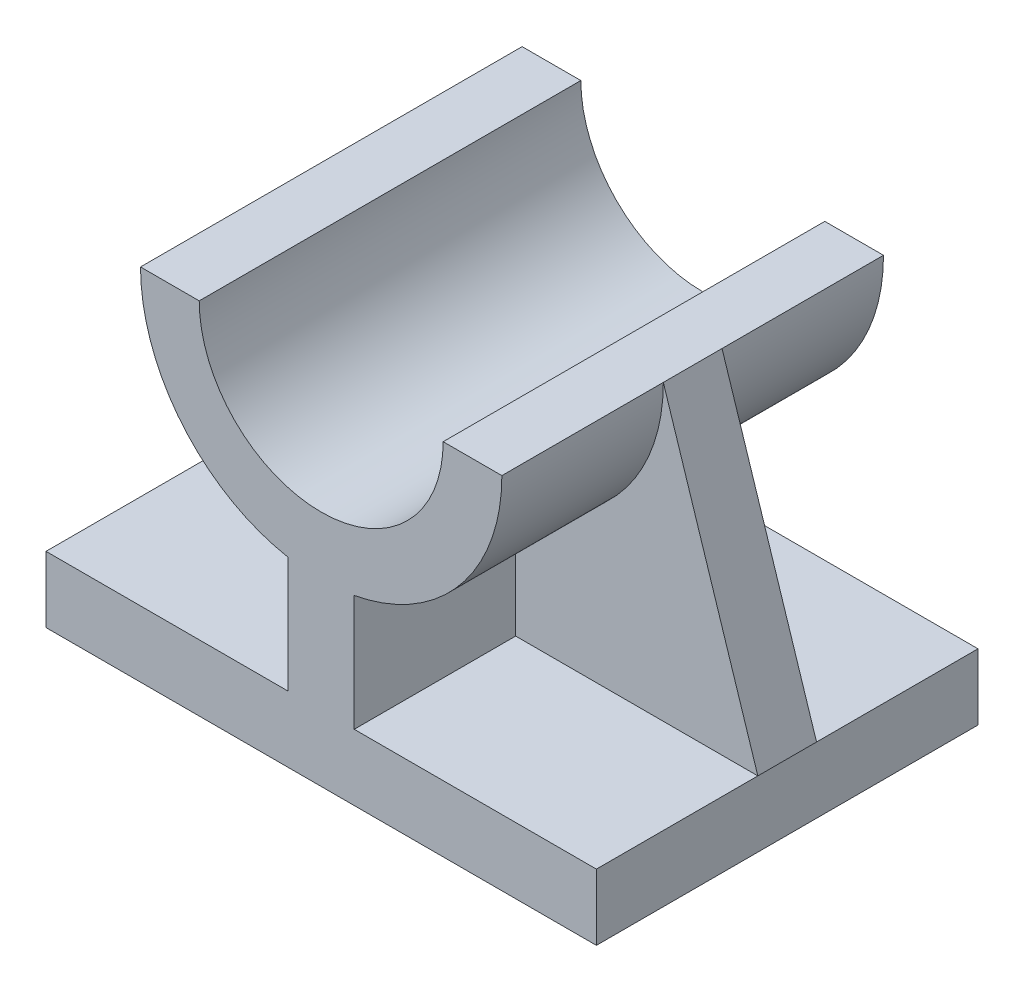
ISO-10303-21;
HEADER;
FILE_DESCRIPTION(('STEP AP214'),'2;1');
FILE_NAME('part.step','',(''),(''),'','','');
FILE_SCHEMA(('AUTOMOTIVE_DESIGN { 1 0 10303 214 1 1 1 1 }'));
ENDSEC;
DATA;
#1=APPLICATION_CONTEXT('core data for automotive mechanical design processes');
#2=APPLICATION_PROTOCOL_DEFINITION('international standard','automotive_design',2000,#1);
#3=PRODUCT_CONTEXT('',#1,'mechanical');
#4=PRODUCT('Part','Part','',(#3));
#5=PRODUCT_RELATED_PRODUCT_CATEGORY('part','',(#4));
#6=PRODUCT_DEFINITION_FORMATION('','',#4);
#7=PRODUCT_DEFINITION_CONTEXT('part definition',#1,'design');
#8=PRODUCT_DEFINITION('design','',#6,#7);
#9=PRODUCT_DEFINITION_SHAPE('','',#8);
#10=(LENGTH_UNIT() NAMED_UNIT(*) SI_UNIT(.MILLI.,.METRE.));
#11=(NAMED_UNIT(*) PLANE_ANGLE_UNIT() SI_UNIT($,.RADIAN.));
#12=(NAMED_UNIT(*) SI_UNIT($,.STERADIAN.) SOLID_ANGLE_UNIT());
#13=UNCERTAINTY_MEASURE_WITH_UNIT(LENGTH_MEASURE(1.E-05),#10,'distance_accuracy_value','');
#14=(GEOMETRIC_REPRESENTATION_CONTEXT(3) GLOBAL_UNCERTAINTY_ASSIGNED_CONTEXT((#13)) GLOBAL_UNIT_ASSIGNED_CONTEXT((#10,
#11,#12)) REPRESENTATION_CONTEXT('',''));
#15=CARTESIAN_POINT('',(0.,0.,0.));
#16=DIRECTION('',(0.,0.,1.));
#17=DIRECTION('',(1.,0.,0.));
#18=AXIS2_PLACEMENT_3D('',#15,#16,#17);
#19=CARTESIAN_POINT('',(0.,8.99999999999999,-26.));
#20=DIRECTION('',(0.,-1.,0.));
#21=DIRECTION('',(1.,0.,0.));
#22=AXIS2_PLACEMENT_3D('',#19,#20,#21);
#23=PLANE('',#22);
#24=DIRECTION('',(1.,0.,0.));
#25=VECTOR('',#24,1.);
#26=CARTESIAN_POINT('',(-4.91390728476821,8.99999999999999,-4.));
#27=LINE('',#26,#25);
#28=CARTESIAN_POINT('',(-37.9139072847682,8.99999999999999,-4.));
#29=VERTEX_POINT('',#28);
#30=CARTESIAN_POINT('',(-4.91390728476821,8.99999999999999,-4.));
#31=VERTEX_POINT('',#30);
#32=EDGE_CURVE('E200',#29,#31,#27,.T.);
#33=ORIENTED_EDGE('',*,*,#32,.T.);
#34=DIRECTION('',(0.,0.,1.));
#35=VECTOR('',#34,1.);
#36=CARTESIAN_POINT('',(-4.91390728476821,8.99999999999999,-26.));
#37=LINE('',#36,#35);
#38=CARTESIAN_POINT('',(-4.91390728476821,8.99999999999999,-26.));
#39=VERTEX_POINT('',#38);
#40=EDGE_CURVE('E199',#39,#31,#37,.T.);
#41=ORIENTED_EDGE('',*,*,#40,.F.);
#42=DIRECTION('',(1.,0.,0.));
#43=VECTOR('',#42,1.);
#44=CARTESIAN_POINT('',(0.,8.99999999999999,-26.));
#45=LINE('',#44,#43);
#46=CARTESIAN_POINT('',(-37.9139072847682,8.99999999999999,-26.));
#47=VERTEX_POINT('',#46);
#48=EDGE_CURVE('E241',#47,#39,#45,.T.);
#49=ORIENTED_EDGE('',*,*,#48,.F.);
#50=DIRECTION('',(0.,0.,1.));
#51=VECTOR('',#50,1.);
#52=CARTESIAN_POINT('',(-37.9139072847682,8.99999999999999,-26.));
#53=LINE('',#52,#51);
#54=EDGE_CURVE('E411',#47,#29,#53,.T.);
#55=ORIENTED_EDGE('',*,*,#54,.T.);
#56=EDGE_LOOP('',(#33,#41,#49,#55));
#57=FACE_BOUND('',#56,.T.);
#58=ADVANCED_FACE('F39',(#57),#23,.F.);
#59=CARTESIAN_POINT('',(-4.91390728476821,0.,-26.));
#60=DIRECTION('',(1.,0.,0.));
#61=DIRECTION('',(0.,0.,-1.));
#62=AXIS2_PLACEMENT_3D('',#59,#60,#61);
#63=PLANE('',#62);
#64=DIRECTION('',(0.,1.,0.));
#65=VECTOR('',#64,1.);
#66=CARTESIAN_POINT('',(-4.91390728476821,24.7934717245168,-4.));
#67=LINE('',#66,#65);
#68=CARTESIAN_POINT('',(-4.91390728476821,24.7934717245168,-4.));
#69=VERTEX_POINT('',#68);
#70=EDGE_CURVE('E182',#31,#69,#67,.T.);
#71=ORIENTED_EDGE('',*,*,#70,.T.);
#72=DIRECTION('',(0.,0.,1.));
#73=VECTOR('',#72,1.);
#74=CARTESIAN_POINT('',(-4.91390728476821,24.7934717245168,-26.));
#75=LINE('',#74,#73);
#76=CARTESIAN_POINT('',(-4.91390728476821,24.7934717245168,-26.));
#77=VERTEX_POINT('',#76);
#78=EDGE_CURVE('E196',#77,#69,#75,.T.);
#79=ORIENTED_EDGE('',*,*,#78,.F.);
#80=DIRECTION('',(0.,1.,0.));
#81=VECTOR('',#80,1.);
#82=CARTESIAN_POINT('',(-4.91390728476821,0.,-26.));
#83=LINE('',#82,#81);
#84=EDGE_CURVE('E253',#39,#77,#83,.T.);
#85=ORIENTED_EDGE('',*,*,#84,.F.);
#86=ORIENTED_EDGE('',*,*,#40,.T.);
#87=EDGE_LOOP('',(#71,#79,#85,#86));
#88=FACE_BOUND('',#87,.T.);
#89=ADVANCED_FACE('F194',(#88),#63,.F.);
#90=CARTESIAN_POINT('',(-0.413907284768214,49.,-26.));
#91=DIRECTION('',(0.,0.,1.));
#92=DIRECTION('',(1.,0.,0.));
#93=AXIS2_PLACEMENT_3D('',#90,#91,#92);
#94=CYLINDRICAL_SURFACE('',#93,24.6212512101186);
#95=ORIENTED_EDGE('',*,*,#78,.T.);
#96=CARTESIAN_POINT('',(-0.41390728476815,49.,-4.));
#97=DIRECTION('',(0.,0.,-1.));
#98=DIRECTION('',(1.,0.,0.));
#99=AXIS2_PLACEMENT_3D('',#96,#97,#98);
#100=CIRCLE('',#99,24.6212512101187);
#101=CARTESIAN_POINT('',(-25.0351584948868,48.9999999999998,-4.));
#102=VERTEX_POINT('',#101);
#103=EDGE_CURVE('E178',#69,#102,#100,.T.);
#104=ORIENTED_EDGE('',*,*,#103,.T.);
#105=DIRECTION('',(0.,0.,1.));
#106=VECTOR('',#105,1.);
#107=CARTESIAN_POINT('',(-25.0351584948868,49.,-26.));
#108=LINE('',#107,#106);
#109=CARTESIAN_POINT('',(-25.0351584948868,49.,-26.));
#110=VERTEX_POINT('',#109);
#111=EDGE_CURVE('E209',#110,#102,#108,.T.);
#112=ORIENTED_EDGE('',*,*,#111,.F.);
#113=CARTESIAN_POINT('',(-0.413907284768214,49.,-26.));
#114=DIRECTION('',(0.,0.,1.));
#115=DIRECTION('',(1.,0.,0.));
#116=AXIS2_PLACEMENT_3D('',#113,#114,#115);
#117=CIRCLE('',#116,24.6212512101186);
#118=EDGE_CURVE('E204',#110,#77,#117,.T.);
#119=ORIENTED_EDGE('',*,*,#118,.T.);
#120=EDGE_LOOP('',(#95,#104,#112,#119));
#121=FACE_BOUND('',#120,.T.);
#122=ADVANCED_FACE('F202',(#121),#94,.T.);
#123=CARTESIAN_POINT('',(4.08609271523178,0.,-26.));
#124=DIRECTION('',(1.,0.,0.));
#125=DIRECTION('',(0.,0.,-1.));
#126=AXIS2_PLACEMENT_3D('',#123,#124,#125);
#127=PLANE('',#126);
#128=DIRECTION('',(0.,0.,1.));
#129=VECTOR('',#128,1.);
#130=CARTESIAN_POINT('',(4.08609271523178,24.7934717245168,-26.));
#131=LINE('',#130,#129);
#132=CARTESIAN_POINT('',(4.08609271523178,24.7934717245168,-26.));
#133=VERTEX_POINT('',#132);
#134=CARTESIAN_POINT('',(4.08609271523178,24.7934717245168,-4.00000000000001));
#135=VERTEX_POINT('',#134);
#136=EDGE_CURVE('E43',#133,#135,#131,.T.);
#137=ORIENTED_EDGE('',*,*,#136,.T.);
#138=DIRECTION('',(0.,-1.,0.));
#139=VECTOR('',#138,1.);
#140=CARTESIAN_POINT('',(4.08609271523178,9.,-4.));
#141=LINE('',#140,#139);
#142=CARTESIAN_POINT('',(4.08609271523178,9.,-4.));
#143=VERTEX_POINT('',#142);
#144=EDGE_CURVE('E64',#135,#143,#141,.T.);
#145=ORIENTED_EDGE('',*,*,#144,.T.);
#146=DIRECTION('',(0.,0.,1.));
#147=VECTOR('',#146,1.);
#148=CARTESIAN_POINT('',(4.08609271523178,9.,-26.));
#149=LINE('',#148,#147);
#150=CARTESIAN_POINT('',(4.08609271523178,9.,-26.));
#151=VERTEX_POINT('',#150);
#152=EDGE_CURVE('E11',#151,#143,#149,.T.);
#153=ORIENTED_EDGE('',*,*,#152,.F.);
#154=DIRECTION('',(0.,1.,0.));
#155=VECTOR('',#154,1.);
#156=CARTESIAN_POINT('',(4.08609271523178,0.,-26.));
#157=LINE('',#156,#155);
#158=EDGE_CURVE('E263',#151,#133,#157,.T.);
#159=ORIENTED_EDGE('',*,*,#158,.T.);
#160=EDGE_LOOP('',(#137,#145,#153,#159));
#161=FACE_BOUND('',#160,.T.);
#162=ADVANCED_FACE('F341',(#161),#127,.T.);
#163=DIRECTION('',(1.,0.,0.));
#164=VECTOR('',#163,1.);
#165=CARTESIAN_POINT('',(37.0860927152318,9.,-4.));
#166=LINE('',#165,#164);
#167=CARTESIAN_POINT('',(37.0860927152318,9.,-4.));
#168=VERTEX_POINT('',#167);
#169=EDGE_CURVE('E276',#143,#168,#166,.T.);
#170=ORIENTED_EDGE('',*,*,#169,.T.);
#171=DIRECTION('',(0.,0.,1.));
#172=VECTOR('',#171,1.);
#173=CARTESIAN_POINT('',(37.0860927152318,9.,-26.));
#174=LINE('',#173,#172);
#175=CARTESIAN_POINT('',(37.0860927152318,9.,-26.));
#176=VERTEX_POINT('',#175);
#177=EDGE_CURVE('E404',#176,#168,#174,.T.);
#178=ORIENTED_EDGE('',*,*,#177,.F.);
#179=EDGE_CURVE('E234',#151,#176,#45,.T.);
#180=ORIENTED_EDGE('',*,*,#179,.F.);
#181=ORIENTED_EDGE('',*,*,#152,.T.);
#182=EDGE_LOOP('',(#170,#178,#180,#181));
#183=FACE_BOUND('',#182,.T.);
#184=ADVANCED_FACE('F332',(#183),#23,.F.);
#185=DIRECTION('',(0.,0.,1.));
#186=VECTOR('',#185,1.);
#187=CARTESIAN_POINT('',(24.2073439253504,49.,-26.));
#188=LINE('',#187,#186);
#189=CARTESIAN_POINT('',(24.2073439253504,49.,-26.));
#190=VERTEX_POINT('',#189);
#191=CARTESIAN_POINT('',(24.2073439253504,49.,-4.));
#192=VERTEX_POINT('',#191);
#193=EDGE_CURVE('E219',#190,#192,#188,.T.);
#194=ORIENTED_EDGE('',*,*,#193,.T.);
#195=CARTESIAN_POINT('',(-0.413907284768318,49.0000000000001,-4.));
#196=DIRECTION('',(0.,0.,-1.));
#197=DIRECTION('',(1.,0.,0.));
#198=AXIS2_PLACEMENT_3D('',#195,#196,#197);
#199=CIRCLE('',#198,24.6212512101187);
#200=EDGE_CURVE('E189',#192,#135,#199,.T.);
#201=ORIENTED_EDGE('',*,*,#200,.T.);
#202=ORIENTED_EDGE('',*,*,#136,.F.);
#203=EDGE_CURVE('E257',#133,#190,#117,.T.);
#204=ORIENTED_EDGE('',*,*,#203,.T.);
#205=EDGE_LOOP('',(#194,#201,#202,#204));
#206=FACE_BOUND('',#205,.T.);
#207=ADVANCED_FACE('F327',(#206),#94,.T.);
#208=DIRECTION('',(0.,-1.,0.));
#209=VECTOR('',#208,1.);
#210=CARTESIAN_POINT('',(4.08609271523178,9.,4.));
#211=LINE('',#210,#209);
#212=CARTESIAN_POINT('',(4.08609271523178,24.7934717245168,4.));
#213=VERTEX_POINT('',#212);
#214=CARTESIAN_POINT('',(4.08609271523178,9.,4.));
#215=VERTEX_POINT('',#214);
#216=EDGE_CURVE('E284',#213,#215,#211,.T.);
#217=ORIENTED_EDGE('',*,*,#216,.F.);
#218=CARTESIAN_POINT('',(4.08609271523178,24.7934717245168,26.));
#219=VERTEX_POINT('',#218);
#220=EDGE_CURVE('E231',#213,#219,#131,.T.);
#221=ORIENTED_EDGE('',*,*,#220,.T.);
#222=DIRECTION('',(0.,1.,0.));
#223=VECTOR('',#222,1.);
#224=CARTESIAN_POINT('',(4.08609271523178,0.,26.));
#225=LINE('',#224,#223);
#226=CARTESIAN_POINT('',(4.08609271523178,9.,26.));
#227=VERTEX_POINT('',#226);
#228=EDGE_CURVE('E268',#227,#219,#225,.T.);
#229=ORIENTED_EDGE('',*,*,#228,.F.);
#230=EDGE_CURVE('E48',#215,#227,#149,.T.);
#231=ORIENTED_EDGE('',*,*,#230,.F.);
#232=EDGE_LOOP('',(#217,#221,#229,#231));
#233=FACE_BOUND('',#232,.T.);
#234=ADVANCED_FACE('F41',(#233),#127,.T.);
#235=CARTESIAN_POINT('',(37.0860927152318,9.,4.));
#236=VERTEX_POINT('',#235);
#237=CARTESIAN_POINT('',(37.0860927152318,9.,26.));
#238=VERTEX_POINT('',#237);
#239=EDGE_CURVE('E408',#236,#238,#174,.T.);
#240=ORIENTED_EDGE('',*,*,#239,.F.);
#241=DIRECTION('',(1.,0.,0.));
#242=VECTOR('',#241,1.);
#243=CARTESIAN_POINT('',(37.0860927152318,9.,4.));
#244=LINE('',#243,#242);
#245=EDGE_CURVE('E282',#215,#236,#244,.T.);
#246=ORIENTED_EDGE('',*,*,#245,.F.);
#247=ORIENTED_EDGE('',*,*,#230,.T.);
#248=DIRECTION('',(1.,0.,0.));
#249=VECTOR('',#248,1.);
#250=CARTESIAN_POINT('',(0.,8.99999999999999,26.));
#251=LINE('',#250,#249);
#252=EDGE_CURVE('E265',#227,#238,#251,.T.);
#253=ORIENTED_EDGE('',*,*,#252,.T.);
#254=EDGE_LOOP('',(#240,#246,#247,#253));
#255=FACE_BOUND('',#254,.T.);
#256=ADVANCED_FACE('F333',(#255),#23,.F.);
#257=CARTESIAN_POINT('',(37.0860927152318,0.,-26.));
#258=DIRECTION('',(1.,0.,0.));
#259=DIRECTION('',(0.,0.,-1.));
#260=AXIS2_PLACEMENT_3D('',#257,#258,#259);
#261=PLANE('',#260);
#262=DIRECTION('',(0.,1.,0.));
#263=VECTOR('',#262,1.);
#264=CARTESIAN_POINT('',(37.0860927152318,0.,26.));
#265=LINE('',#264,#263);
#266=CARTESIAN_POINT('',(37.0860927152318,0.,26.));
#267=VERTEX_POINT('',#266);
#268=EDGE_CURVE('E406',#267,#238,#265,.T.);
#269=ORIENTED_EDGE('',*,*,#268,.F.);
#270=DIRECTION('',(0.,0.,1.));
#271=VECTOR('',#270,1.);
#272=CARTESIAN_POINT('',(37.0860927152318,0.,-26.));
#273=LINE('',#272,#271);
#274=CARTESIAN_POINT('',(37.0860927152318,0.,-26.));
#275=VERTEX_POINT('',#274);
#276=EDGE_CURVE('E397',#275,#267,#273,.T.);
#277=ORIENTED_EDGE('',*,*,#276,.F.);
#278=DIRECTION('',(0.,1.,0.));
#279=VECTOR('',#278,1.);
#280=CARTESIAN_POINT('',(37.0860927152318,0.,-26.));
#281=LINE('',#280,#279);
#282=EDGE_CURVE('E239',#275,#176,#281,.T.);
#283=ORIENTED_EDGE('',*,*,#282,.T.);
#284=ORIENTED_EDGE('',*,*,#177,.T.);
#285=DIRECTION('',(0.,0.,-1.));
#286=VECTOR('',#285,1.);
#287=CARTESIAN_POINT('',(37.0860927152318,9.,4.));
#288=LINE('',#287,#286);
#289=EDGE_CURVE('E266',#236,#168,#288,.T.);
#290=ORIENTED_EDGE('',*,*,#289,.F.);
#291=ORIENTED_EDGE('',*,*,#239,.T.);
#292=EDGE_LOOP('',(#269,#277,#283,#284,#290,#291));
#293=FACE_BOUND('',#292,.T.);
#294=ADVANCED_FACE('F345',(#293),#261,.T.);
#295=CARTESIAN_POINT('',(0.,0.,-26.));
#296=DIRECTION('',(0.,-1.,0.));
#297=DIRECTION('',(0.,0.,-1.));
#298=AXIS2_PLACEMENT_3D('',#295,#296,#297);
#299=PLANE('',#298);
#300=DIRECTION('',(1.,0.,0.));
#301=VECTOR('',#300,1.);
#302=CARTESIAN_POINT('',(0.,0.,26.));
#303=LINE('',#302,#301);
#304=CARTESIAN_POINT('',(-37.9139072847682,0.,26.));
#305=VERTEX_POINT('',#304);
#306=EDGE_CURVE('E418',#305,#267,#303,.T.);
#307=ORIENTED_EDGE('',*,*,#306,.F.);
#308=DIRECTION('',(0.,0.,1.));
#309=VECTOR('',#308,1.);
#310=CARTESIAN_POINT('',(-37.9139072847682,0.,-26.));
#311=LINE('',#310,#309);
#312=CARTESIAN_POINT('',(-37.9139072847682,0.,-26.));
#313=VERTEX_POINT('',#312);
#314=EDGE_CURVE('E399',#313,#305,#311,.T.);
#315=ORIENTED_EDGE('',*,*,#314,.F.);
#316=DIRECTION('',(1.,0.,0.));
#317=VECTOR('',#316,1.);
#318=CARTESIAN_POINT('',(0.,0.,-26.));
#319=LINE('',#318,#317);
#320=EDGE_CURVE('E248',#313,#275,#319,.T.);
#321=ORIENTED_EDGE('',*,*,#320,.T.);
#322=ORIENTED_EDGE('',*,*,#276,.T.);
#323=EDGE_LOOP('',(#307,#315,#321,#322));
#324=FACE_BOUND('',#323,.T.);
#325=ADVANCED_FACE('F351',(#324),#299,.T.);
#326=CARTESIAN_POINT('',(-37.9139072847682,0.,-26.));
#327=DIRECTION('',(1.,0.,0.));
#328=DIRECTION('',(0.,0.,-1.));
#329=AXIS2_PLACEMENT_3D('',#326,#327,#328);
#330=PLANE('',#329);
#331=DIRECTION('',(0.,1.,0.));
#332=VECTOR('',#331,1.);
#333=CARTESIAN_POINT('',(-37.9139072847682,0.,26.));
#334=LINE('',#333,#332);
#335=CARTESIAN_POINT('',(-37.9139072847682,8.99999999999999,26.));
#336=VERTEX_POINT('',#335);
#337=EDGE_CURVE('E417',#305,#336,#334,.T.);
#338=ORIENTED_EDGE('',*,*,#337,.T.);
#339=CARTESIAN_POINT('',(-37.9139072847682,8.99999999999999,4.));
#340=VERTEX_POINT('',#339);
#341=EDGE_CURVE('E414',#340,#336,#53,.T.);
#342=ORIENTED_EDGE('',*,*,#341,.F.);
#343=DIRECTION('',(0.,0.,-1.));
#344=VECTOR('',#343,1.);
#345=CARTESIAN_POINT('',(-37.9139072847682,8.99999999999999,4.));
#346=LINE('',#345,#344);
#347=EDGE_CURVE('E293',#340,#29,#346,.T.);
#348=ORIENTED_EDGE('',*,*,#347,.T.);
#349=ORIENTED_EDGE('',*,*,#54,.F.);
#350=DIRECTION('',(0.,1.,0.));
#351=VECTOR('',#350,1.);
#352=CARTESIAN_POINT('',(-37.9139072847682,0.,-26.));
#353=LINE('',#352,#351);
#354=EDGE_CURVE('E252',#313,#47,#353,.T.);
#355=ORIENTED_EDGE('',*,*,#354,.F.);
#356=ORIENTED_EDGE('',*,*,#314,.T.);
#357=EDGE_LOOP('',(#338,#342,#348,#349,#355,#356));
#358=FACE_BOUND('',#357,.T.);
#359=ADVANCED_FACE('F355',(#358),#330,.F.);
#360=CARTESIAN_POINT('',(-4.91390728476821,8.99999999999999,4.));
#361=VERTEX_POINT('',#360);
#362=CARTESIAN_POINT('',(-4.91390728476821,8.99999999999999,26.));
#363=VERTEX_POINT('',#362);
#364=EDGE_CURVE('E205',#361,#363,#37,.T.);
#365=ORIENTED_EDGE('',*,*,#364,.F.);
#366=DIRECTION('',(1.,0.,0.));
#367=VECTOR('',#366,1.);
#368=CARTESIAN_POINT('',(-4.91390728476821,8.99999999999999,4.));
#369=LINE('',#368,#367);
#370=EDGE_CURVE('E290',#340,#361,#369,.T.);
#371=ORIENTED_EDGE('',*,*,#370,.F.);
#372=ORIENTED_EDGE('',*,*,#341,.T.);
#373=EDGE_CURVE('E369',#336,#363,#251,.T.);
#374=ORIENTED_EDGE('',*,*,#373,.T.);
#375=EDGE_LOOP('',(#365,#371,#372,#374));
#376=FACE_BOUND('',#375,.T.);
#377=ADVANCED_FACE('F343',(#376),#23,.F.);
#378=CARTESIAN_POINT('',(-4.91390728476821,24.7934717245168,4.));
#379=VERTEX_POINT('',#378);
#380=CARTESIAN_POINT('',(-4.91390728476821,24.7934717245168,26.));
#381=VERTEX_POINT('',#380);
#382=EDGE_CURVE('E206',#379,#381,#75,.T.);
#383=ORIENTED_EDGE('',*,*,#382,.F.);
#384=DIRECTION('',(0.,1.,0.));
#385=VECTOR('',#384,1.);
#386=CARTESIAN_POINT('',(-4.91390728476821,24.7934717245168,4.));
#387=LINE('',#386,#385);
#388=EDGE_CURVE('E292',#361,#379,#387,.T.);
#389=ORIENTED_EDGE('',*,*,#388,.F.);
#390=ORIENTED_EDGE('',*,*,#364,.T.);
#391=DIRECTION('',(0.,1.,0.));
#392=VECTOR('',#391,1.);
#393=CARTESIAN_POINT('',(-4.91390728476821,0.,26.));
#394=LINE('',#393,#392);
#395=EDGE_CURVE('E374',#363,#381,#394,.T.);
#396=ORIENTED_EDGE('',*,*,#395,.T.);
#397=EDGE_LOOP('',(#383,#389,#390,#396));
#398=FACE_BOUND('',#397,.T.);
#399=ADVANCED_FACE('F338',(#398),#63,.F.);
#400=CARTESIAN_POINT('',(-0.41390728476815,49.,4.));
#401=DIRECTION('',(0.,0.,-1.));
#402=DIRECTION('',(1.,0.,0.));
#403=AXIS2_PLACEMENT_3D('',#400,#401,#402);
#404=CIRCLE('',#403,24.6212512101187);
#405=CARTESIAN_POINT('',(-25.0351584948868,49.,3.99999999999999));
#406=VERTEX_POINT('',#405);
#407=EDGE_CURVE('E56',#379,#406,#404,.T.);
#408=ORIENTED_EDGE('',*,*,#407,.F.);
#409=ORIENTED_EDGE('',*,*,#382,.T.);
#410=CARTESIAN_POINT('',(-0.413907284768214,49.,26.));
#411=DIRECTION('',(0.,0.,1.));
#412=DIRECTION('',(1.,0.,0.));
#413=AXIS2_PLACEMENT_3D('',#410,#411,#412);
#414=CIRCLE('',#413,24.6212512101186);
#415=CARTESIAN_POINT('',(-25.0351584948868,49.,26.));
#416=VERTEX_POINT('',#415);
#417=EDGE_CURVE('E379',#416,#381,#414,.T.);
#418=ORIENTED_EDGE('',*,*,#417,.F.);
#419=EDGE_CURVE('E213',#406,#416,#108,.T.);
#420=ORIENTED_EDGE('',*,*,#419,.F.);
#421=EDGE_LOOP('',(#408,#409,#418,#420));
#422=FACE_BOUND('',#421,.T.);
#423=ADVANCED_FACE('F326',(#422),#94,.T.);
#424=CARTESIAN_POINT('',(0.,49.,-26.));
#425=DIRECTION('',(0.,-1.,0.));
#426=DIRECTION('',(0.,0.,-1.));
#427=AXIS2_PLACEMENT_3D('',#424,#425,#426);
#428=PLANE('',#427);
#429=DIRECTION('',(1.,0.,0.));
#430=VECTOR('',#429,1.);
#431=CARTESIAN_POINT('',(0.,49.,26.));
#432=LINE('',#431,#430);
#433=CARTESIAN_POINT('',(-17.0351584948868,49.,26.));
#434=VERTEX_POINT('',#433);
#435=EDGE_CURVE('E380',#416,#434,#432,.T.);
#436=ORIENTED_EDGE('',*,*,#435,.T.);
#437=DIRECTION('',(0.,0.,1.));
#438=VECTOR('',#437,1.);
#439=CARTESIAN_POINT('',(-17.0351584948868,49.,-26.));
#440=LINE('',#439,#438);
#441=CARTESIAN_POINT('',(-17.0351584948868,49.,-26.));
#442=VERTEX_POINT('',#441);
#443=EDGE_CURVE('E214',#442,#434,#440,.T.);
#444=ORIENTED_EDGE('',*,*,#443,.F.);
#445=DIRECTION('',(1.,0.,0.));
#446=VECTOR('',#445,1.);
#447=CARTESIAN_POINT('',(0.,49.,-26.));
#448=LINE('',#447,#446);
#449=EDGE_CURVE('E255',#110,#442,#448,.T.);
#450=ORIENTED_EDGE('',*,*,#449,.F.);
#451=ORIENTED_EDGE('',*,*,#111,.T.);
#452=DIRECTION('',(0.,0.,-1.));
#453=VECTOR('',#452,1.);
#454=CARTESIAN_POINT('',(-25.0351584948868,48.9999999999998,4.));
#455=LINE('',#454,#453);
#456=EDGE_CURVE('E299',#406,#102,#455,.T.);
#457=ORIENTED_EDGE('',*,*,#456,.F.);
#458=ORIENTED_EDGE('',*,*,#419,.T.);
#459=EDGE_LOOP('',(#436,#444,#450,#451,#457,#458));
#460=FACE_BOUND('',#459,.T.);
#461=ADVANCED_FACE('F306',(#460),#428,.F.);
#462=CARTESIAN_POINT('',(-0.413907284768214,49.,-26.));
#463=DIRECTION('',(0.,0.,1.));
#464=DIRECTION('',(1.,0.,0.));
#465=AXIS2_PLACEMENT_3D('',#462,#463,#464);
#466=CYLINDRICAL_SURFACE('',#465,16.6212512101186);
#467=CARTESIAN_POINT('',(-0.413907284768214,49.,26.));
#468=DIRECTION('',(0.,0.,1.));
#469=DIRECTION('',(1.,0.,0.));
#470=AXIS2_PLACEMENT_3D('',#467,#468,#469);
#471=CIRCLE('',#470,16.6212512101186);
#472=CARTESIAN_POINT('',(16.2073439253504,49.,26.));
#473=VERTEX_POINT('',#472);
#474=EDGE_CURVE('E384',#434,#473,#471,.T.);
#475=ORIENTED_EDGE('',*,*,#474,.T.);
#476=DIRECTION('',(0.,0.,1.));
#477=VECTOR('',#476,1.);
#478=CARTESIAN_POINT('',(16.2073439253504,49.,-26.));
#479=LINE('',#478,#477);
#480=CARTESIAN_POINT('',(16.2073439253504,49.,-26.));
#481=VERTEX_POINT('',#480);
#482=EDGE_CURVE('E217',#481,#473,#479,.T.);
#483=ORIENTED_EDGE('',*,*,#482,.F.);
#484=CARTESIAN_POINT('',(-0.413907284768214,49.,-26.));
#485=DIRECTION('',(0.,0.,1.));
#486=DIRECTION('',(1.,0.,0.));
#487=AXIS2_PLACEMENT_3D('',#484,#485,#486);
#488=CIRCLE('',#487,16.6212512101186);
#489=EDGE_CURVE('E259',#442,#481,#488,.T.);
#490=ORIENTED_EDGE('',*,*,#489,.F.);
#491=ORIENTED_EDGE('',*,*,#443,.T.);
#492=EDGE_LOOP('',(#475,#483,#490,#491));
#493=FACE_BOUND('',#492,.T.);
#494=ADVANCED_FACE('F438',(#493),#466,.F.);
#495=CARTESIAN_POINT('',(24.2073439253504,49.,26.));
#496=VERTEX_POINT('',#495);
#497=EDGE_CURVE('E386',#473,#496,#432,.T.);
#498=ORIENTED_EDGE('',*,*,#497,.T.);
#499=CARTESIAN_POINT('',(24.2073439253504,49.,4.));
#500=VERTEX_POINT('',#499);
#501=EDGE_CURVE('E221',#500,#496,#188,.T.);
#502=ORIENTED_EDGE('',*,*,#501,.F.);
#503=DIRECTION('',(0.,0.,-1.));
#504=VECTOR('',#503,1.);
#505=CARTESIAN_POINT('',(24.2073439253504,49.,4.));
#506=LINE('',#505,#504);
#507=EDGE_CURVE('E269',#500,#192,#506,.T.);
#508=ORIENTED_EDGE('',*,*,#507,.T.);
#509=ORIENTED_EDGE('',*,*,#193,.F.);
#510=EDGE_CURVE('E261',#481,#190,#448,.T.);
#511=ORIENTED_EDGE('',*,*,#510,.F.);
#512=ORIENTED_EDGE('',*,*,#482,.T.);
#513=EDGE_LOOP('',(#498,#502,#508,#509,#511,#512));
#514=FACE_BOUND('',#513,.T.);
#515=ADVANCED_FACE('F324',(#514),#428,.F.);
#516=CARTESIAN_POINT('',(-0.413907284768318,49.0000000000001,4.));
#517=DIRECTION('',(0.,0.,-1.));
#518=DIRECTION('',(1.,0.,0.));
#519=AXIS2_PLACEMENT_3D('',#516,#517,#518);
#520=CIRCLE('',#519,24.6212512101187);
#521=EDGE_CURVE('E275',#500,#213,#520,.T.);
#522=ORIENTED_EDGE('',*,*,#521,.F.);
#523=ORIENTED_EDGE('',*,*,#501,.T.);
#524=EDGE_CURVE('E382',#219,#496,#414,.T.);
#525=ORIENTED_EDGE('',*,*,#524,.F.);
#526=ORIENTED_EDGE('',*,*,#220,.F.);
#527=EDGE_LOOP('',(#522,#523,#525,#526));
#528=FACE_BOUND('',#527,.T.);
#529=ADVANCED_FACE('F315',(#528),#94,.T.);
#530=CARTESIAN_POINT('',(0.,0.,-26.));
#531=DIRECTION('',(0.,0.,1.));
#532=DIRECTION('',(1.,0.,0.));
#533=AXIS2_PLACEMENT_3D('',#530,#531,#532);
#534=PLANE('',#533);
#535=ORIENTED_EDGE('',*,*,#158,.F.);
#536=ORIENTED_EDGE('',*,*,#179,.T.);
#537=ORIENTED_EDGE('',*,*,#282,.F.);
#538=ORIENTED_EDGE('',*,*,#320,.F.);
#539=ORIENTED_EDGE('',*,*,#354,.T.);
#540=ORIENTED_EDGE('',*,*,#48,.T.);
#541=ORIENTED_EDGE('',*,*,#84,.T.);
#542=ORIENTED_EDGE('',*,*,#118,.F.);
#543=ORIENTED_EDGE('',*,*,#449,.T.);
#544=ORIENTED_EDGE('',*,*,#489,.T.);
#545=ORIENTED_EDGE('',*,*,#510,.T.);
#546=ORIENTED_EDGE('',*,*,#203,.F.);
#547=EDGE_LOOP('',(#535,#536,#537,#538,#539,#540,#541,#542,#543,#544,#545,#546));
#548=FACE_BOUND('',#547,.T.);
#549=ADVANCED_FACE('F311',(#548),#534,.F.);
#550=CARTESIAN_POINT('',(0.,0.,26.));
#551=DIRECTION('',(0.,0.,1.));
#552=DIRECTION('',(1.,0.,0.));
#553=AXIS2_PLACEMENT_3D('',#550,#551,#552);
#554=PLANE('',#553);
#555=ORIENTED_EDGE('',*,*,#228,.T.);
#556=ORIENTED_EDGE('',*,*,#524,.T.);
#557=ORIENTED_EDGE('',*,*,#497,.F.);
#558=ORIENTED_EDGE('',*,*,#474,.F.);
#559=ORIENTED_EDGE('',*,*,#435,.F.);
#560=ORIENTED_EDGE('',*,*,#417,.T.);
#561=ORIENTED_EDGE('',*,*,#395,.F.);
#562=ORIENTED_EDGE('',*,*,#373,.F.);
#563=ORIENTED_EDGE('',*,*,#337,.F.);
#564=ORIENTED_EDGE('',*,*,#306,.T.);
#565=ORIENTED_EDGE('',*,*,#268,.T.);
#566=ORIENTED_EDGE('',*,*,#252,.F.);
#567=EDGE_LOOP('',(#555,#556,#557,#558,#559,#560,#561,#562,#563,#564,#565,#566));
#568=FACE_BOUND('',#567,.T.);
#569=ADVANCED_FACE('F314',(#568),#554,.T.);
#570=CARTESIAN_POINT('',(24.2073439253504,49.,4.));
#571=DIRECTION('',(-0.9518786585316,-0.306475153041944,0.));
#572=DIRECTION('',(0.306475153041944,-0.9518786585316,0.));
#573=AXIS2_PLACEMENT_3D('',#570,#571,#572);
#574=PLANE('',#573);
#575=DIRECTION('',(-0.306475153041944,0.951878658531599,0.));
#576=VECTOR('',#575,1.);
#577=CARTESIAN_POINT('',(24.2073439253504,49.,-4.));
#578=LINE('',#577,#576);
#579=EDGE_CURVE('E273',#168,#192,#578,.T.);
#580=ORIENTED_EDGE('',*,*,#579,.T.);
#581=ORIENTED_EDGE('',*,*,#507,.F.);
#582=DIRECTION('',(-0.306475153041944,0.951878658531599,0.));
#583=VECTOR('',#582,1.);
#584=CARTESIAN_POINT('',(24.2073439253504,49.,4.));
#585=LINE('',#584,#583);
#586=EDGE_CURVE('E272',#236,#500,#585,.T.);
#587=ORIENTED_EDGE('',*,*,#586,.F.);
#588=ORIENTED_EDGE('',*,*,#289,.T.);
#589=EDGE_LOOP('',(#580,#581,#587,#588));
#590=FACE_BOUND('',#589,.T.);
#591=ADVANCED_FACE('F321',(#590),#574,.F.);
#592=CARTESIAN_POINT('',(-0.413907284768318,49.0000000000001,4.));
#593=DIRECTION('',(0.,0.,1.));
#594=DIRECTION('',(1.,0.,0.));
#595=AXIS2_PLACEMENT_3D('',#592,#593,#594);
#596=PLANE('',#595);
#597=ORIENTED_EDGE('',*,*,#521,.T.);
#598=ORIENTED_EDGE('',*,*,#216,.T.);
#599=ORIENTED_EDGE('',*,*,#245,.T.);
#600=ORIENTED_EDGE('',*,*,#586,.T.);
#601=EDGE_LOOP('',(#597,#598,#599,#600));
#602=FACE_BOUND('',#601,.T.);
#603=ADVANCED_FACE('F428',(#602),#596,.T.);
#604=CARTESIAN_POINT('',(-0.413907284768318,49.0000000000001,-4.));
#605=DIRECTION('',(0.,0.,1.));
#606=DIRECTION('',(1.,0.,0.));
#607=AXIS2_PLACEMENT_3D('',#604,#605,#606);
#608=PLANE('',#607);
#609=ORIENTED_EDGE('',*,*,#200,.F.);
#610=ORIENTED_EDGE('',*,*,#579,.F.);
#611=ORIENTED_EDGE('',*,*,#169,.F.);
#612=ORIENTED_EDGE('',*,*,#144,.F.);
#613=EDGE_LOOP('',(#609,#610,#611,#612));
#614=FACE_BOUND('',#613,.T.);
#615=ADVANCED_FACE('F439',(#614),#608,.F.);
#616=CARTESIAN_POINT('',(-25.0351584948868,48.9999999999998,4.));
#617=DIRECTION('',(0.951878658531599,-0.306475153041945,0.));
#618=DIRECTION('',(0.306475153041945,0.951878658531599,0.));
#619=AXIS2_PLACEMENT_3D('',#616,#617,#618);
#620=PLANE('',#619);
#621=DIRECTION('',(-0.306475153041945,-0.951878658531599,0.));
#622=VECTOR('',#621,1.);
#623=CARTESIAN_POINT('',(-25.0351584948868,48.9999999999998,-4.));
#624=LINE('',#623,#622);
#625=EDGE_CURVE('E184',#102,#29,#624,.T.);
#626=ORIENTED_EDGE('',*,*,#625,.T.);
#627=ORIENTED_EDGE('',*,*,#347,.F.);
#628=DIRECTION('',(-0.306475153041945,-0.951878658531599,0.));
#629=VECTOR('',#628,1.);
#630=CARTESIAN_POINT('',(-25.0351584948868,48.9999999999998,4.));
#631=LINE('',#630,#629);
#632=EDGE_CURVE('E288',#406,#340,#631,.T.);
#633=ORIENTED_EDGE('',*,*,#632,.F.);
#634=ORIENTED_EDGE('',*,*,#456,.T.);
#635=EDGE_LOOP('',(#626,#627,#633,#634));
#636=FACE_BOUND('',#635,.T.);
#637=ADVANCED_FACE('F302',(#636),#620,.F.);
#638=CARTESIAN_POINT('',(-0.41390728476815,49.,4.));
#639=DIRECTION('',(0.,0.,1.));
#640=DIRECTION('',(1.,0.,0.));
#641=AXIS2_PLACEMENT_3D('',#638,#639,#640);
#642=PLANE('',#641);
#643=ORIENTED_EDGE('',*,*,#407,.T.);
#644=ORIENTED_EDGE('',*,*,#632,.T.);
#645=ORIENTED_EDGE('',*,*,#370,.T.);
#646=ORIENTED_EDGE('',*,*,#388,.T.);
#647=EDGE_LOOP('',(#643,#644,#645,#646));
#648=FACE_BOUND('',#647,.T.);
#649=ADVANCED_FACE('F376',(#648),#642,.T.);
#650=CARTESIAN_POINT('',(-0.41390728476815,49.,-4.));
#651=DIRECTION('',(0.,0.,1.));
#652=DIRECTION('',(1.,0.,0.));
#653=AXIS2_PLACEMENT_3D('',#650,#651,#652);
#654=PLANE('',#653);
#655=ORIENTED_EDGE('',*,*,#103,.F.);
#656=ORIENTED_EDGE('',*,*,#70,.F.);
#657=ORIENTED_EDGE('',*,*,#32,.F.);
#658=ORIENTED_EDGE('',*,*,#625,.F.);
#659=EDGE_LOOP('',(#655,#656,#657,#658));
#660=FACE_BOUND('',#659,.T.);
#661=ADVANCED_FACE('F180',(#660),#654,.F.);
#662=CLOSED_SHELL('',(#58,#89,#122,#162,#184,#207,#234,#256,#294,#325,#359,#377,#399,#423,#461,
#494,#515,#529,#549,#569,#591,#603,#615,#637,#649,#661));
#663=MANIFOLD_SOLID_BREP('B2',#662);
#664=ADVANCED_BREP_SHAPE_REPRESENTATION('',(#18,#663),#14);
#665=SHAPE_DEFINITION_REPRESENTATION(#9,#664);
ENDSEC;
END-ISO-10303-21;
